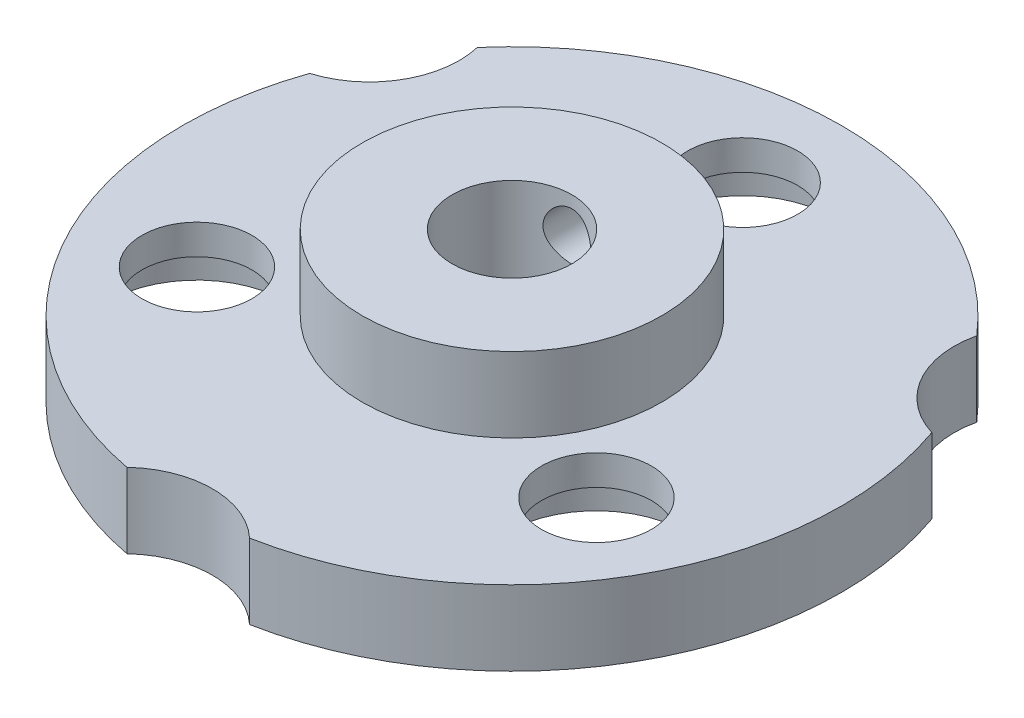
ISO-10303-21;
HEADER;
FILE_DESCRIPTION(('STEP AP214'),'2;1');
FILE_NAME('part.step','',(''),(''),'','','');
FILE_SCHEMA(('AUTOMOTIVE_DESIGN { 1 0 10303 214 1 1 1 1 }'));
ENDSEC;
DATA;
#1=APPLICATION_CONTEXT('core data for automotive mechanical design processes');
#2=APPLICATION_PROTOCOL_DEFINITION('international standard','automotive_design',2000,#1);
#3=PRODUCT_CONTEXT('',#1,'mechanical');
#4=PRODUCT('Part','Part','',(#3));
#5=PRODUCT_RELATED_PRODUCT_CATEGORY('part','',(#4));
#6=PRODUCT_DEFINITION_FORMATION('','',#4);
#7=PRODUCT_DEFINITION_CONTEXT('part definition',#1,'design');
#8=PRODUCT_DEFINITION('design','',#6,#7);
#9=PRODUCT_DEFINITION_SHAPE('','',#8);
#10=(LENGTH_UNIT() NAMED_UNIT(*) SI_UNIT(.MILLI.,.METRE.));
#11=(NAMED_UNIT(*) PLANE_ANGLE_UNIT() SI_UNIT($,.RADIAN.));
#12=(NAMED_UNIT(*) SI_UNIT($,.STERADIAN.) SOLID_ANGLE_UNIT());
#13=UNCERTAINTY_MEASURE_WITH_UNIT(LENGTH_MEASURE(1.E-05),#10,'distance_accuracy_value','');
#14=(GEOMETRIC_REPRESENTATION_CONTEXT(3) GLOBAL_UNCERTAINTY_ASSIGNED_CONTEXT((#13)) GLOBAL_UNIT_ASSIGNED_CONTEXT((#10,
#11,#12)) REPRESENTATION_CONTEXT('',''));
#15=CARTESIAN_POINT('',(0.,0.,0.));
#16=DIRECTION('',(0.,0.,1.));
#17=DIRECTION('',(1.,0.,0.));
#18=AXIS2_PLACEMENT_3D('',#15,#16,#17);
#19=CARTESIAN_POINT('',(0.,0.,-7.7));
#20=DIRECTION('',(0.,1.,0.));
#21=DIRECTION('',(0.,0.,1.));
#22=AXIS2_PLACEMENT_3D('',#19,#20,#21);
#23=CYLINDRICAL_SURFACE('',#22,1.83552150537951);
#24=CARTESIAN_POINT('',(0.,2.5,-7.7));
#25=DIRECTION('',(0.,1.,0.));
#26=DIRECTION('',(0.,0.,1.));
#27=AXIS2_PLACEMENT_3D('',#24,#25,#26);
#28=CIRCLE('',#27,1.83552150537951);
#29=CARTESIAN_POINT('',(0.,2.5,-5.86447849462049));
#30=VERTEX_POINT('',#29);
#31=EDGE_CURVE('E259',#30,#30,#28,.T.);
#32=ORIENTED_EDGE('',*,*,#31,.T.);
#33=EDGE_LOOP('',(#32));
#34=FACE_BOUND('',#33,.T.);
#35=CARTESIAN_POINT('',(0.,1.5,-7.7));
#36=DIRECTION('',(0.,-1.,0.));
#37=DIRECTION('',(0.,0.,-1.));
#38=AXIS2_PLACEMENT_3D('',#35,#36,#37);
#39=CIRCLE('',#38,1.83552150537951);
#40=CARTESIAN_POINT('',(0.,1.5,-9.5355215053795));
#41=VERTEX_POINT('',#40);
#42=EDGE_CURVE('E37',#41,#41,#39,.F.);
#43=ORIENTED_EDGE('',*,*,#42,.F.);
#44=EDGE_LOOP('',(#43));
#45=FACE_BOUND('',#44,.T.);
#46=ADVANCED_FACE('F33',(#34,#45),#23,.F.);
#47=CARTESIAN_POINT('',(-6.66839560914018,0.,3.85));
#48=DIRECTION('',(0.,1.,0.));
#49=DIRECTION('',(0.,0.,1.));
#50=AXIS2_PLACEMENT_3D('',#47,#48,#49);
#51=CYLINDRICAL_SURFACE('',#50,1.83552150537951);
#52=CARTESIAN_POINT('',(-6.66839560914018,2.5,3.85));
#53=DIRECTION('',(0.,1.,0.));
#54=DIRECTION('',(0.,0.,1.));
#55=AXIS2_PLACEMENT_3D('',#52,#53,#54);
#56=CIRCLE('',#55,1.83552150537951);
#57=CARTESIAN_POINT('',(-6.66839560914018,2.5,5.68552150537951));
#58=VERTEX_POINT('',#57);
#59=EDGE_CURVE('E263',#58,#58,#56,.T.);
#60=ORIENTED_EDGE('',*,*,#59,.T.);
#61=EDGE_LOOP('',(#60));
#62=FACE_BOUND('',#61,.T.);
#63=CARTESIAN_POINT('',(-6.66839560914018,1.5,3.85));
#64=DIRECTION('',(0.,-1.,0.));
#65=DIRECTION('',(0.,0.,-1.));
#66=AXIS2_PLACEMENT_3D('',#63,#64,#65);
#67=CIRCLE('',#66,1.83552150537951);
#68=CARTESIAN_POINT('',(-6.66839560914018,1.5,2.0144784946205));
#69=VERTEX_POINT('',#68);
#70=EDGE_CURVE('E127',#69,#69,#67,.F.);
#71=ORIENTED_EDGE('',*,*,#70,.F.);
#72=EDGE_LOOP('',(#71));
#73=FACE_BOUND('',#72,.T.);
#74=ADVANCED_FACE('F218',(#62,#73),#51,.F.);
#75=CARTESIAN_POINT('',(6.66839560914018,0.,3.85));
#76=DIRECTION('',(0.,1.,0.));
#77=DIRECTION('',(0.,0.,1.));
#78=AXIS2_PLACEMENT_3D('',#75,#76,#77);
#79=CYLINDRICAL_SURFACE('',#78,1.83552150537951);
#80=CARTESIAN_POINT('',(6.66839560914018,2.5,3.85));
#81=DIRECTION('',(0.,1.,0.));
#82=DIRECTION('',(0.,0.,1.));
#83=AXIS2_PLACEMENT_3D('',#80,#81,#82);
#84=CIRCLE('',#83,1.83552150537951);
#85=CARTESIAN_POINT('',(6.66839560914018,2.5,5.6855215053795));
#86=VERTEX_POINT('',#85);
#87=EDGE_CURVE('E260',#86,#86,#84,.T.);
#88=ORIENTED_EDGE('',*,*,#87,.T.);
#89=EDGE_LOOP('',(#88));
#90=FACE_BOUND('',#89,.T.);
#91=CARTESIAN_POINT('',(6.66839560914018,1.5,3.85));
#92=DIRECTION('',(0.,-1.,0.));
#93=DIRECTION('',(0.,0.,-1.));
#94=AXIS2_PLACEMENT_3D('',#91,#92,#93);
#95=CIRCLE('',#94,1.83552150537951);
#96=CARTESIAN_POINT('',(6.66839560914018,1.5,2.01447849462049));
#97=VERTEX_POINT('',#96);
#98=EDGE_CURVE('E103',#97,#97,#95,.F.);
#99=ORIENTED_EDGE('',*,*,#98,.F.);
#100=EDGE_LOOP('',(#99));
#101=FACE_BOUND('',#100,.T.);
#102=ADVANCED_FACE('F225',(#90,#101),#79,.F.);
#103=CARTESIAN_POINT('',(0.,2.5,0.));
#104=DIRECTION('',(0.,-1.,0.));
#105=DIRECTION('',(0.,0.,-1.));
#106=AXIS2_PLACEMENT_3D('',#103,#104,#105);
#107=CYLINDRICAL_SURFACE('',#106,11.);
#108=CARTESIAN_POINT('',(0.,0.,0.));
#109=DIRECTION('',(0.,1.,0.));
#110=DIRECTION('',(0.,0.,1.));
#111=AXIS2_PLACEMENT_3D('',#108,#109,#110);
#112=CIRCLE('',#111,11.);
#113=CARTESIAN_POINT('',(2.04787377107266,0.,10.8076923076924));
#114=VERTEX_POINT('',#113);
#115=CARTESIAN_POINT('',(10.3836729802836,0.,-3.63033544435343));
#116=VERTEX_POINT('',#115);
#117=EDGE_CURVE('E112',#114,#116,#112,.T.);
#118=ORIENTED_EDGE('',*,*,#117,.T.);
#119=DIRECTION('',(0.,1.,0.));
#120=VECTOR('',#119,1.);
#121=CARTESIAN_POINT('',(10.3836729802836,-0.25,-3.63033544435342));
#122=LINE('',#121,#120);
#123=CARTESIAN_POINT('',(10.3836729802836,2.5,-3.63033544435342));
#124=VERTEX_POINT('',#123);
#125=EDGE_CURVE('E50',#116,#124,#122,.T.);
#126=ORIENTED_EDGE('',*,*,#125,.T.);
#127=CARTESIAN_POINT('',(0.,2.5,0.));
#128=DIRECTION('',(0.,1.,0.));
#129=DIRECTION('',(0.,0.,1.));
#130=AXIS2_PLACEMENT_3D('',#127,#128,#129);
#131=CIRCLE('',#130,11.);
#132=CARTESIAN_POINT('',(2.04787377107267,2.5,10.8076923076924));
#133=VERTEX_POINT('',#132);
#134=EDGE_CURVE('E102',#133,#124,#131,.T.);
#135=ORIENTED_EDGE('',*,*,#134,.F.);
#136=DIRECTION('',(0.,1.,0.));
#137=VECTOR('',#136,1.);
#138=CARTESIAN_POINT('',(2.04787377107266,-0.25,10.8076923076924));
#139=LINE('',#138,#137);
#140=EDGE_CURVE('E151',#133,#114,#139,.F.);
#141=ORIENTED_EDGE('',*,*,#140,.T.);
#142=EDGE_LOOP('',(#118,#126,#135,#141));
#143=FACE_BOUND('',#142,.T.);
#144=ADVANCED_FACE('F246',(#143),#107,.T.);
#145=CARTESIAN_POINT('',(-10.3836729802836,0.,-3.6303354443534));
#146=VERTEX_POINT('',#145);
#147=CARTESIAN_POINT('',(-2.04787377107266,0.,10.8076923076924));
#148=VERTEX_POINT('',#147);
#149=EDGE_CURVE('E108',#146,#148,#112,.T.);
#150=ORIENTED_EDGE('',*,*,#149,.T.);
#151=DIRECTION('',(0.,1.,0.));
#152=VECTOR('',#151,1.);
#153=CARTESIAN_POINT('',(-2.04787377107266,-0.25,10.8076923076924));
#154=LINE('',#153,#152);
#155=CARTESIAN_POINT('',(-2.04787377107267,2.5,10.8076923076924));
#156=VERTEX_POINT('',#155);
#157=EDGE_CURVE('E57',#148,#156,#154,.T.);
#158=ORIENTED_EDGE('',*,*,#157,.T.);
#159=CARTESIAN_POINT('',(-10.3836729802836,2.5,-3.63033544435341));
#160=VERTEX_POINT('',#159);
#161=EDGE_CURVE('E110',#160,#156,#131,.T.);
#162=ORIENTED_EDGE('',*,*,#161,.F.);
#163=DIRECTION('',(0.,1.,0.));
#164=VECTOR('',#163,1.);
#165=CARTESIAN_POINT('',(-10.3836729802836,-0.25,-3.63033544435341));
#166=LINE('',#165,#164);
#167=EDGE_CURVE('E157',#160,#146,#166,.F.);
#168=ORIENTED_EDGE('',*,*,#167,.T.);
#169=EDGE_LOOP('',(#150,#158,#162,#168));
#170=FACE_BOUND('',#169,.T.);
#171=ADVANCED_FACE('F233',(#170),#107,.T.);
#172=CARTESIAN_POINT('',(0.,2.5,0.));
#173=DIRECTION('',(0.,1.,0.));
#174=DIRECTION('',(0.,0.,1.));
#175=AXIS2_PLACEMENT_3D('',#172,#173,#174);
#176=PLANE('',#175);
#177=CARTESIAN_POINT('',(11.258330249198,2.5,-6.50000000000016));
#178=DIRECTION('',(0.,1.,0.));
#179=DIRECTION('',(0.,0.,1.));
#180=AXIS2_PLACEMENT_3D('',#177,#178,#179);
#181=CIRCLE('',#180,3.);
#182=CARTESIAN_POINT('',(8.33579920921091,2.5,-7.17735686333895));
#183=VERTEX_POINT('',#182);
#184=EDGE_CURVE('E88',#183,#124,#181,.T.);
#185=ORIENTED_EDGE('',*,*,#184,.F.);
#186=CARTESIAN_POINT('',(-8.33579920921092,2.5,-7.17735686333894));
#187=VERTEX_POINT('',#186);
#188=EDGE_CURVE('E98',#183,#187,#131,.T.);
#189=ORIENTED_EDGE('',*,*,#188,.T.);
#190=CARTESIAN_POINT('',(-11.258330249198,2.5,-6.50000000000015));
#191=DIRECTION('',(0.,1.,0.));
#192=DIRECTION('',(0.,0.,1.));
#193=AXIS2_PLACEMENT_3D('',#190,#191,#192);
#194=CIRCLE('',#193,3.);
#195=EDGE_CURVE('E155',#160,#187,#194,.T.);
#196=ORIENTED_EDGE('',*,*,#195,.F.);
#197=ORIENTED_EDGE('',*,*,#161,.T.);
#198=CARTESIAN_POINT('',(0.,2.5,13.0000000000003));
#199=DIRECTION('',(0.,1.,0.));
#200=DIRECTION('',(0.,0.,1.));
#201=AXIS2_PLACEMENT_3D('',#198,#199,#200);
#202=CIRCLE('',#201,3.);
#203=EDGE_CURVE('E149',#133,#156,#202,.T.);
#204=ORIENTED_EDGE('',*,*,#203,.F.);
#205=ORIENTED_EDGE('',*,*,#134,.T.);
#206=EDGE_LOOP('',(#185,#189,#196,#197,#204,#205));
#207=FACE_BOUND('',#206,.T.);
#208=ORIENTED_EDGE('',*,*,#31,.F.);
#209=EDGE_LOOP('',(#208));
#210=FACE_BOUND('',#209,.T.);
#211=ORIENTED_EDGE('',*,*,#87,.F.);
#212=EDGE_LOOP('',(#211));
#213=FACE_BOUND('',#212,.T.);
#214=ORIENTED_EDGE('',*,*,#59,.F.);
#215=EDGE_LOOP('',(#214));
#216=FACE_BOUND('',#215,.T.);
#217=CARTESIAN_POINT('',(0.,2.5,0.));
#218=DIRECTION('',(0.,1.,0.));
#219=DIRECTION('',(0.,0.,1.));
#220=AXIS2_PLACEMENT_3D('',#217,#218,#219);
#221=CIRCLE('',#220,5.);
#222=CARTESIAN_POINT('',(0.,2.5,5.));
#223=VERTEX_POINT('',#222);
#224=EDGE_CURVE('E269',#223,#223,#221,.T.);
#225=ORIENTED_EDGE('',*,*,#224,.F.);
#226=EDGE_LOOP('',(#225));
#227=FACE_BOUND('',#226,.T.);
#228=ADVANCED_FACE('F95',(#207,#210,#213,#216,#227),#176,.T.);
#229=ORIENTED_EDGE('',*,*,#188,.F.);
#230=DIRECTION('',(0.,1.,0.));
#231=VECTOR('',#230,1.);
#232=CARTESIAN_POINT('',(8.33579920921091,-0.25,-7.17735686333894));
#233=LINE('',#232,#231);
#234=CARTESIAN_POINT('',(8.33579920921092,0.,-7.17735686333894));
#235=VERTEX_POINT('',#234);
#236=EDGE_CURVE('E85',#183,#235,#233,.F.);
#237=ORIENTED_EDGE('',*,*,#236,.T.);
#238=CARTESIAN_POINT('',(-8.33579920921091,0.,-7.17735686333895));
#239=VERTEX_POINT('',#238);
#240=EDGE_CURVE('E114',#235,#239,#112,.T.);
#241=ORIENTED_EDGE('',*,*,#240,.T.);
#242=DIRECTION('',(0.,1.,0.));
#243=VECTOR('',#242,1.);
#244=CARTESIAN_POINT('',(-8.33579920921092,-0.25,-7.17735686333895));
#245=LINE('',#244,#243);
#246=EDGE_CURVE('E107',#239,#187,#245,.T.);
#247=ORIENTED_EDGE('',*,*,#246,.T.);
#248=EDGE_LOOP('',(#229,#237,#241,#247));
#249=FACE_BOUND('',#248,.T.);
#250=ADVANCED_FACE('F35',(#249),#107,.T.);
#251=CARTESIAN_POINT('',(0.,0.,0.));
#252=DIRECTION('',(0.,1.,0.));
#253=DIRECTION('',(0.,0.,1.));
#254=AXIS2_PLACEMENT_3D('',#251,#252,#253);
#255=PLANE('',#254);
#256=CARTESIAN_POINT('',(0.,0.,-7.7));
#257=DIRECTION('',(0.,-1.,0.));
#258=DIRECTION('',(0.,0.,-1.));
#259=AXIS2_PLACEMENT_3D('',#256,#257,#258);
#260=CIRCLE('',#259,3.);
#261=CARTESIAN_POINT('',(0.,0.,-10.7));
#262=VERTEX_POINT('',#261);
#263=EDGE_CURVE('E143',#262,#262,#260,.T.);
#264=ORIENTED_EDGE('',*,*,#263,.F.);
#265=EDGE_LOOP('',(#264));
#266=FACE_BOUND('',#265,.T.);
#267=CARTESIAN_POINT('',(-6.66839560914018,0.,3.85));
#268=DIRECTION('',(0.,-1.,0.));
#269=DIRECTION('',(0.,0.,-1.));
#270=AXIS2_PLACEMENT_3D('',#267,#268,#269);
#271=CIRCLE('',#270,3.);
#272=CARTESIAN_POINT('',(-6.66839560914018,0.,0.850000000000001));
#273=VERTEX_POINT('',#272);
#274=EDGE_CURVE('E136',#273,#273,#271,.T.);
#275=ORIENTED_EDGE('',*,*,#274,.F.);
#276=EDGE_LOOP('',(#275));
#277=FACE_BOUND('',#276,.T.);
#278=CARTESIAN_POINT('',(6.66839560914018,0.,3.85));
#279=DIRECTION('',(0.,-1.,0.));
#280=DIRECTION('',(0.,0.,-1.));
#281=AXIS2_PLACEMENT_3D('',#278,#279,#280);
#282=CIRCLE('',#281,3.);
#283=CARTESIAN_POINT('',(6.66839560914018,0.,0.849999999999996));
#284=VERTEX_POINT('',#283);
#285=EDGE_CURVE('E129',#284,#284,#282,.T.);
#286=ORIENTED_EDGE('',*,*,#285,.F.);
#287=EDGE_LOOP('',(#286));
#288=FACE_BOUND('',#287,.T.);
#289=CARTESIAN_POINT('',(0.,0.,0.));
#290=DIRECTION('',(0.,1.,0.));
#291=DIRECTION('',(0.,0.,1.));
#292=AXIS2_PLACEMENT_3D('',#289,#290,#291);
#293=CIRCLE('',#292,2.);
#294=CARTESIAN_POINT('',(0.,0.,2.));
#295=VERTEX_POINT('',#294);
#296=EDGE_CURVE('E256',#295,#295,#293,.T.);
#297=ORIENTED_EDGE('',*,*,#296,.T.);
#298=EDGE_LOOP('',(#297));
#299=FACE_BOUND('',#298,.T.);
#300=ORIENTED_EDGE('',*,*,#240,.F.);
#301=CARTESIAN_POINT('',(11.258330249198,0.,-6.50000000000016));
#302=DIRECTION('',(0.,1.,0.));
#303=DIRECTION('',(0.,0.,1.));
#304=AXIS2_PLACEMENT_3D('',#301,#302,#303);
#305=CIRCLE('',#304,3.);
#306=EDGE_CURVE('E11',#235,#116,#305,.T.);
#307=ORIENTED_EDGE('',*,*,#306,.T.);
#308=ORIENTED_EDGE('',*,*,#117,.F.);
#309=CARTESIAN_POINT('',(0.,0.,13.0000000000003));
#310=DIRECTION('',(0.,1.,0.));
#311=DIRECTION('',(0.,0.,1.));
#312=AXIS2_PLACEMENT_3D('',#309,#310,#311);
#313=CIRCLE('',#312,3.);
#314=EDGE_CURVE('E42',#114,#148,#313,.T.);
#315=ORIENTED_EDGE('',*,*,#314,.T.);
#316=ORIENTED_EDGE('',*,*,#149,.F.);
#317=CARTESIAN_POINT('',(-11.258330249198,0.,-6.50000000000015));
#318=DIRECTION('',(0.,1.,0.));
#319=DIRECTION('',(0.,0.,1.));
#320=AXIS2_PLACEMENT_3D('',#317,#318,#319);
#321=CIRCLE('',#320,3.);
#322=EDGE_CURVE('E117',#146,#239,#321,.T.);
#323=ORIENTED_EDGE('',*,*,#322,.T.);
#324=EDGE_LOOP('',(#300,#307,#308,#315,#316,#323));
#325=FACE_BOUND('',#324,.T.);
#326=ADVANCED_FACE('F234',(#266,#277,#288,#299,#325),#255,.F.);
#327=CARTESIAN_POINT('',(0.,5.,0.));
#328=DIRECTION('',(0.,-1.,0.));
#329=DIRECTION('',(0.,0.,-1.));
#330=AXIS2_PLACEMENT_3D('',#327,#328,#329);
#331=CYLINDRICAL_SURFACE('',#330,5.);
#332=CARTESIAN_POINT('',(0.,4.59295521709407,-5.));
#333=CARTESIAN_POINT('',(-0.0446345464348313,4.59280840972482,-4.99999925421206));
#334=CARTESIAN_POINT('',(-0.0892819443510236,4.58891705369241,-4.9993960875234));
#335=CARTESIAN_POINT('',(-0.177301891678727,4.57375034444031,-4.99704993433986));
#336=CARTESIAN_POINT('',(-0.220673197606511,4.56246802289333,-4.99530587219164));
#337=CARTESIAN_POINT('',(-0.304854977903621,4.53286726162525,-4.99087558705497));
#338=CARTESIAN_POINT('',(-0.345667459361669,4.51455441889718,-4.98819011367073));
#339=CARTESIAN_POINT('',(-0.423635297501165,4.47142634078325,-4.98217463731942));
#340=CARTESIAN_POINT('',(-0.460791109846799,4.44661191698615,-4.97884471481213));
#341=CARTESIAN_POINT('',(-0.530725668288752,4.39095066663555,-4.97187860497349));
#342=CARTESIAN_POINT('',(-0.563467348194362,4.36005754142335,-4.96824019736804));
#343=CARTESIAN_POINT('',(-0.623325168104827,4.29321676146511,-4.96108624127247));
#344=CARTESIAN_POINT('',(-0.650440971001116,4.25726880404452,-4.95757070015512));
#345=CARTESIAN_POINT('',(-0.698418461816588,4.18109293926852,-4.95104061891818));
#346=CARTESIAN_POINT('',(-0.719244831066632,4.1408425198778,-4.94802894895029));
#347=CARTESIAN_POINT('',(-0.753826505269504,4.0573583918758,-4.9428790397377));
#348=CARTESIAN_POINT('',(-0.767582254949818,4.01412487108954,-4.94074074556118));
#349=CARTESIAN_POINT('',(-0.787517076477999,3.92629609351829,-4.93760253956309));
#350=CARTESIAN_POINT('',(-0.793760297058806,3.88171574712982,-4.93659299479914));
#351=CARTESIAN_POINT('',(-0.798690889447801,3.79212975820018,-4.93579776042976));
#352=CARTESIAN_POINT('',(-0.797378748811143,3.74712414328914,-4.9360119918528));
#353=CARTESIAN_POINT('',(-0.787288858704422,3.65841063797979,-4.93763113481972));
#354=CARTESIAN_POINT('',(-0.778581283745989,3.61469453280229,-4.93902485388638));
#355=CARTESIAN_POINT('',(-0.754056623447387,3.52935153996084,-4.94282826426096));
#356=CARTESIAN_POINT('',(-0.738239305621578,3.48772472066515,-4.94523798879167));
#357=CARTESIAN_POINT('',(-0.699868024192291,3.40752234623805,-4.95081411790351));
#358=CARTESIAN_POINT('',(-0.677283485215563,3.36896166684933,-4.95398394347471));
#359=CARTESIAN_POINT('',(-0.626041212269111,3.29614996590887,-4.9607195182505));
#360=CARTESIAN_POINT('',(-0.597383026549829,3.26189926522965,-4.96428529689616));
#361=CARTESIAN_POINT('',(-0.534418967683772,3.19827161328361,-4.97145948250141));
#362=CARTESIAN_POINT('',(-0.500052548802766,3.16895454552508,-4.97506791289197));
#363=CARTESIAN_POINT('',(-0.426855352339007,3.11649466439161,-4.98188150665978));
#364=CARTESIAN_POINT('',(-0.388024554815837,3.09335187859599,-4.98508666823568));
#365=CARTESIAN_POINT('',(-0.306953152851498,3.05389666610304,-4.99073439993172));
#366=CARTESIAN_POINT('',(-0.264710579067382,3.03758821841366,-4.99317652559617));
#367=CARTESIAN_POINT('',(-0.178038476907493,3.01231358506911,-4.99701733008075));
#368=CARTESIAN_POINT('',(-0.133609117789079,3.00334683211061,-4.99841608952256));
#369=CARTESIAN_POINT('',(-0.0443428342577001,2.99308885599946,-5.00000045238604));
#370=CARTESIAN_POINT('',(0.000484388161034169,2.99171513888676,-5.00019909658237));
#371=CARTESIAN_POINT('',(0.0897277032897241,2.99646392886732,-4.99939398406668));
#372=CARTESIAN_POINT('',(0.134143810122924,3.00258617747796,-4.99839026881552));
#373=CARTESIAN_POINT('',(0.221058825336589,3.02208504347062,-4.99529929653219));
#374=CARTESIAN_POINT('',(0.263566806501661,3.03542223188221,-4.99321793138338));
#375=CARTESIAN_POINT('',(0.345743289629186,3.06893109522977,-4.98820186778873));
#376=CARTESIAN_POINT('',(0.385411640694736,3.08910313304105,-4.98526712403657));
#377=CARTESIAN_POINT('',(0.461145134721012,3.13590295965188,-4.97883553280157));
#378=CARTESIAN_POINT('',(0.49717764390488,3.16258293348531,-4.97533422270727));
#379=CARTESIAN_POINT('',(0.564283089849037,3.22156791963512,-4.9681712513089));
#380=CARTESIAN_POINT('',(0.595355698403196,3.25387330390017,-4.9645095794138));
#381=CARTESIAN_POINT('',(0.651957795364863,3.3235577117943,-4.9573959412819));
#382=CARTESIAN_POINT('',(0.677432262603723,3.36098169719568,-4.95394627756548));
#383=CARTESIAN_POINT('',(0.721732833216668,3.43962673186726,-4.9476867714127));
#384=CARTESIAN_POINT('',(0.740559142226738,3.48084766364334,-4.94487690918741));
#385=CARTESIAN_POINT('',(0.770943170127823,3.56575058190925,-4.94023112007101));
#386=CARTESIAN_POINT('',(0.782530149288911,3.60942187342313,-4.93839127728325));
#387=CARTESIAN_POINT('',(0.79819980367199,3.69812236414841,-4.93588301608632));
#388=CARTESIAN_POINT('',(0.802283073557574,3.74315145546765,-4.93521450485016));
#389=CARTESIAN_POINT('',(0.802815962429541,3.83273817599765,-4.93512779371066));
#390=CARTESIAN_POINT('',(0.799352463469276,3.87729529912648,-4.93569536340789));
#391=CARTESIAN_POINT('',(0.78507589069214,3.96518430315666,-4.93798615841887));
#392=CARTESIAN_POINT('',(0.774262828172742,4.00851618594129,-4.93970938195619));
#393=CARTESIAN_POINT('',(0.745624187596046,4.09270216575181,-4.94411292837317));
#394=CARTESIAN_POINT('',(0.727804436540425,4.1335582892027,-4.94679245578731));
#395=CARTESIAN_POINT('',(0.685666554935631,4.21171525048427,-4.9528085340871));
#396=CARTESIAN_POINT('',(0.661348141854866,4.24901593364528,-4.95614511353666));
#397=CARTESIAN_POINT('',(0.606587081465107,4.3194447098727,-4.96314620762862));
#398=CARTESIAN_POINT('',(0.57608008604431,4.3525224588935,-4.9668139223735));
#399=CARTESIAN_POINT('',(0.509945409149719,4.41311877418437,-4.97403858748415));
#400=CARTESIAN_POINT('',(0.474316548786263,4.44063605709539,-4.97759551211962));
#401=CARTESIAN_POINT('',(0.398688189514482,4.48948390134341,-4.98422474154444));
#402=CARTESIAN_POINT('',(0.358663017320111,4.51077513877548,-4.98729391237595));
#403=CARTESIAN_POINT('',(0.275572401990428,4.54629917536374,-4.99257309312883));
#404=CARTESIAN_POINT('',(0.232510090751464,4.56053912765659,-4.9947839732444));
#405=CARTESIAN_POINT('',(0.157722389070857,4.57841711433274,-4.99760747858701));
#406=CARTESIAN_POINT('',(0.126447109545309,4.58395060419822,-4.99850013479712));
#407=CARTESIAN_POINT('',(0.0634500468027397,4.59127180597416,-4.99969665612681));
#408=CARTESIAN_POINT('',(0.0317282703374389,4.59305957446456,-5.00000053014007));
#409=CARTESIAN_POINT('',(0.,4.59295521709407,-5.));
#410=B_SPLINE_CURVE_WITH_KNOTS('',3,(#332,#333,#334,#335,#336,#337,#338,#339,#340,#341,#342,
#343,#344,#345,#346,#347,#348,#349,#350,#351,#352,#353,#354,#355,#356,#357,#358,#359,#360,#361,
#362,#363,#364,#365,#366,#367,#368,#369,#370,#371,#372,#373,#374,#375,#376,#377,#378,#379,#380,
#381,#382,#383,#384,#385,#386,#387,#388,#389,#390,#391,#392,#393,#394,#395,#396,#397,#398,#399,
#400,#401,#402,#403,#404,#405,#406,#407,#408,#409),.UNSPECIFIED.,.T.,.F.,(4,2,2,2,2,2,2,2,2,2,2,
2,2,2,2,2,2,2,2,2,2,2,2,2,2,2,2,2,2,2,2,2,2,2,2,2,2,2,4),(0.,0.133788385130539,
0.267703090104946,0.401511406008692,0.535303026646016,0.670156140567426,0.805017332699408,
0.940622335585652,1.07621880815101,1.21064902767122,1.34507057236968,1.47823067492862,
1.61139513208442,1.7451705597479,1.87895594093932,2.01426343587848,2.14957153520019,
2.28495830293327,2.42033460814823,2.55423719337488,2.68813516138254,2.82130867464517,
2.95448925945418,3.08877506801445,3.22306975884365,3.3586305509906,3.49418714970257,
3.62919224330303,3.7641866373849,3.8976351294267,4.03108341633699,4.16442095702508,
4.29776429555247,4.43257259927336,4.56741198138658,4.70308547687105,4.83862105572563,
4.933725375399,5.02882825849044),.UNSPECIFIED.);
#411=CARTESIAN_POINT('',(0.,4.59295521709407,-5.));
#412=VERTEX_POINT('',#411);
#413=EDGE_CURVE('E168',#412,#412,#410,.T.);
#414=ORIENTED_EDGE('',*,*,#413,.T.);
#415=EDGE_LOOP('',(#414));
#416=FACE_BOUND('',#415,.T.);
#417=CARTESIAN_POINT('',(0.,5.,0.));
#418=DIRECTION('',(0.,1.,0.));
#419=DIRECTION('',(0.,0.,1.));
#420=AXIS2_PLACEMENT_3D('',#417,#418,#419);
#421=CIRCLE('',#420,5.);
#422=CARTESIAN_POINT('',(0.,5.,5.));
#423=VERTEX_POINT('',#422);
#424=EDGE_CURVE('E268',#423,#423,#421,.T.);
#425=ORIENTED_EDGE('',*,*,#424,.F.);
#426=EDGE_LOOP('',(#425));
#427=FACE_BOUND('',#426,.T.);
#428=ORIENTED_EDGE('',*,*,#224,.T.);
#429=EDGE_LOOP('',(#428));
#430=FACE_BOUND('',#429,.T.);
#431=ADVANCED_FACE('F236',(#416,#427,#430),#331,.T.);
#432=CARTESIAN_POINT('',(0.,5.,0.));
#433=DIRECTION('',(0.,1.,0.));
#434=DIRECTION('',(0.,0.,1.));
#435=AXIS2_PLACEMENT_3D('',#432,#433,#434);
#436=PLANE('',#435);
#437=CARTESIAN_POINT('',(0.,5.,0.));
#438=DIRECTION('',(0.,1.,0.));
#439=DIRECTION('',(0.,0.,1.));
#440=AXIS2_PLACEMENT_3D('',#437,#438,#439);
#441=CIRCLE('',#440,2.);
#442=CARTESIAN_POINT('',(0.,5.,2.));
#443=VERTEX_POINT('',#442);
#444=EDGE_CURVE('E274',#443,#443,#441,.T.);
#445=ORIENTED_EDGE('',*,*,#444,.F.);
#446=EDGE_LOOP('',(#445));
#447=FACE_BOUND('',#446,.T.);
#448=ORIENTED_EDGE('',*,*,#424,.T.);
#449=EDGE_LOOP('',(#448));
#450=FACE_BOUND('',#449,.T.);
#451=ADVANCED_FACE('F243',(#447,#450),#436,.T.);
#452=CARTESIAN_POINT('',(0.,-0.5,0.));
#453=DIRECTION('',(0.,1.,0.));
#454=DIRECTION('',(0.,0.,1.));
#455=AXIS2_PLACEMENT_3D('',#452,#453,#454);
#456=CYLINDRICAL_SURFACE('',#455,2.);
#457=CARTESIAN_POINT('',(-0.799047163232813,3.79295943814312,-1.83344583528655));
#458=CARTESIAN_POINT('',(-0.799042462665124,3.83581523738308,-1.83345016148734));
#459=CARTESIAN_POINT('',(-0.795582298961543,3.878731652025,-1.83496816656248));
#460=CARTESIAN_POINT('',(-0.781870924640436,3.96333337129395,-1.84085028760058));
#461=CARTESIAN_POINT('',(-0.77160236073739,4.00501524497531,-1.84522167583811));
#462=CARTESIAN_POINT('',(-0.74472932715532,4.08578061493114,-1.85622915151899));
#463=CARTESIAN_POINT('',(-0.728148728191176,4.12487325708722,-1.86285669680965));
#464=CARTESIAN_POINT('',(-0.689192297844292,4.19971345848696,-1.87761712591289));
#465=CARTESIAN_POINT('',(-0.666817731835187,4.23546174580346,-1.88574968092829));
#466=CARTESIAN_POINT('',(-0.615539712811226,4.3046635990397,-1.90312364779918));
#467=CARTESIAN_POINT('',(-0.586357840324346,4.3379020073149,-1.91240069322624));
#468=CARTESIAN_POINT('',(-0.522880208430889,4.39917103706927,-1.93072185889342));
#469=CARTESIAN_POINT('',(-0.488582669464801,4.42719983865906,-1.93976589678943));
#470=CARTESIAN_POINT('',(-0.414185402195356,4.4783219969362,-1.95702917136805));
#471=CARTESIAN_POINT('',(-0.373910211072263,4.50117715873137,-1.96520182230166));
#472=CARTESIAN_POINT('',(-0.289701380398091,4.53969686549904,-1.97936655195159));
#473=CARTESIAN_POINT('',(-0.245769238148498,4.55536433645589,-1.9853595177737));
#474=CARTESIAN_POINT('',(-0.15775007590205,4.57829603271807,-1.99423556096864));
#475=CARTESIAN_POINT('',(-0.113773523697688,4.58593036377872,-1.99725515136257));
#476=CARTESIAN_POINT('',(-0.0250668487170979,4.59377083240819,-2.00033454157052));
#477=CARTESIAN_POINT('',(0.0196629867650228,4.59397974051705,-2.00039544531936));
#478=CARTESIAN_POINT('',(0.105931294208234,4.58716633023312,-1.99763306267521));
#479=CARTESIAN_POINT('',(0.147507899770071,4.58054952904434,-1.99497158842065));
#480=CARTESIAN_POINT('',(0.228902174751904,4.56096228761881,-1.98727846099662));
#481=CARTESIAN_POINT('',(0.268719714875986,4.54799138118296,-1.98224663391601));
#482=CARTESIAN_POINT('',(0.346183249643453,4.51590484499259,-1.97020763308979));
#483=CARTESIAN_POINT('',(0.383787471768837,4.4966995522169,-1.96317183115119));
#484=CARTESIAN_POINT('',(0.455335714177721,4.45277343537551,-1.94782194029242));
#485=CARTESIAN_POINT('',(0.489278474026519,4.42805072090407,-1.93950741355362));
#486=CARTESIAN_POINT('',(0.554906472629291,4.37189978376448,-1.92179839226061));
#487=CARTESIAN_POINT('',(0.586297182710696,4.34013788110958,-1.91236883284082));
#488=CARTESIAN_POINT('',(0.643427425666812,4.27176320941473,-1.89391247433249));
#489=CARTESIAN_POINT('',(0.669165108827847,4.23514885888145,-1.88488580784112));
#490=CARTESIAN_POINT('',(0.714932684947921,4.15679182917954,-1.86801625144648));
#491=CARTESIAN_POINT('',(0.734780817558311,4.11493350594959,-1.86021400116245));
#492=CARTESIAN_POINT('',(0.767030676121984,4.02807324195831,-1.84715194248047));
#493=CARTESIAN_POINT('',(0.779437238497364,3.98307336423478,-1.8418904832071));
#494=CARTESIAN_POINT('',(0.795735790485007,3.8941451271687,-1.83490569798837));
#495=CARTESIAN_POINT('',(0.800101652415489,3.85031925929505,-1.83298585564763));
#496=CARTESIAN_POINT('',(0.801577009622707,3.76252855503594,-1.83234161445076));
#497=CARTESIAN_POINT('',(0.798688705387972,3.71856376483198,-1.83361624657819));
#498=CARTESIAN_POINT('',(0.786169103831115,3.63437586416117,-1.83901580962576));
#499=CARTESIAN_POINT('',(0.776931226908903,3.59408226318332,-1.84297426536608));
#500=CARTESIAN_POINT('',(0.752484930936952,3.51564407622872,-1.85308934576475));
#501=CARTESIAN_POINT('',(0.737275188035641,3.4774999689002,-1.85924645779688));
#502=CARTESIAN_POINT('',(0.700628046591321,3.40271849502493,-1.8733712247657));
#503=CARTESIAN_POINT('',(0.678963109315047,3.36620496266534,-1.88140217745099));
#504=CARTESIAN_POINT('',(0.630252814553532,3.29716624316646,-1.89827421927866));
#505=CARTESIAN_POINT('',(0.603205265897451,3.26464268902489,-1.9071156375548));
#506=CARTESIAN_POINT('',(0.542138497452119,3.20201007470344,-1.9254021441529));
#507=CARTESIAN_POINT('',(0.507751887159069,3.17225681202671,-1.93484358333461));
#508=CARTESIAN_POINT('',(0.434248415737526,3.11888860749899,-1.95265373874898));
#509=CARTESIAN_POINT('',(0.395131362162263,3.09527391550423,-1.96102241131014));
#510=CARTESIAN_POINT('',(0.313138935684557,3.05494038755864,-1.97577237459626));
#511=CARTESIAN_POINT('',(0.270264465652488,3.03821990047681,-1.98215414108649));
#512=CARTESIAN_POINT('',(0.181992917293085,3.01233989718007,-1.99219653103666));
#513=CARTESIAN_POINT('',(0.136597222310326,3.0031762775671,-1.9958586311747));
#514=CARTESIAN_POINT('',(0.0477660664283565,2.99315755749297,-1.99989147626839));
#515=CARTESIAN_POINT('',(0.00439594967590211,2.99179938675807,-2.0004613723665));
#516=CARTESIAN_POINT('',(-0.0819346635675842,2.99610162985677,-1.99878702553996));
#517=CARTESIAN_POINT('',(-0.124895221072546,3.00176098125737,-1.99654320860292));
#518=CARTESIAN_POINT('',(-0.207834285010329,3.01957815348652,-1.98959434533991));
#519=CARTESIAN_POINT('',(-0.247863856579021,3.03153101657335,-1.98496701941007));
#520=CARTESIAN_POINT('',(-0.325343117641275,3.06138055996786,-1.97374915700592));
#521=CARTESIAN_POINT('',(-0.362792329762863,3.07927833655126,-1.96715825846082));
#522=CARTESIAN_POINT('',(-0.43586655616293,3.12140071753886,-1.95229918545447));
#523=CARTESIAN_POINT('',(-0.471337828202994,3.14586995609716,-1.94396976221287));
#524=CARTESIAN_POINT('',(-0.537820302467067,3.2000748458147,-1.9266374083776));
#525=CARTESIAN_POINT('',(-0.568829649016988,3.22981267672717,-1.91763419991543));
#526=CARTESIAN_POINT('',(-0.627493429707883,3.29588552795315,-1.89927745433076));
#527=CARTESIAN_POINT('',(-0.654821337141409,3.33251498750357,-1.88993673310011));
#528=CARTESIAN_POINT('',(-0.702965798364044,3.41013629311463,-1.8725643096112));
#529=CARTESIAN_POINT('',(-0.723781586606334,3.45112865130707,-1.86453276130883));
#530=CARTESIAN_POINT('',(-0.756634245727271,3.53257431888235,-1.85142897319136));
#531=CARTESIAN_POINT('',(-0.769291558814073,3.57274553204359,-1.84615576781002));
#532=CARTESIAN_POINT('',(-0.788131797050594,3.65475360599526,-1.83819389903301));
#533=CARTESIAN_POINT('',(-0.794332763107589,3.69658548452991,-1.83549803553179));
#534=CARTESIAN_POINT('',(-0.798432727575443,3.75671046307829,-1.83371307301416));
#535=CARTESIAN_POINT('',(-0.799049151782278,3.77482952654216,-1.83344400511096));
#536=CARTESIAN_POINT('',(-0.799047163232813,3.79295943814312,-1.83344583528655));
#537=B_SPLINE_CURVE_WITH_KNOTS('',3,(#457,#458,#459,#460,#461,#462,#463,#464,#465,#466,#467,
#468,#469,#470,#471,#472,#473,#474,#475,#476,#477,#478,#479,#480,#481,#482,#483,#484,#485,#486,
#487,#488,#489,#490,#491,#492,#493,#494,#495,#496,#497,#498,#499,#500,#501,#502,#503,#504,#505,
#506,#507,#508,#509,#510,#511,#512,#513,#514,#515,#516,#517,#518,#519,#520,#521,#522,#523,#524,
#525,#526,#527,#528,#529,#530,#531,#532,#533,#534,#535,#536),.UNSPECIFIED.,.T.,.F.,(4,2,2,2,2,2,
2,2,2,2,2,2,2,2,2,2,2,2,2,2,2,2,2,2,2,2,2,2,2,2,2,2,2,2,2,2,2,2,2,4),(0.,0.128511059507061,
0.257350934328896,0.385708329317353,0.514037715295441,0.649022473137693,0.784054297393363,
0.924410676365705,1.06470986787791,1.19821673154872,1.33167378122268,1.4576345793212,
1.58360462051623,1.71147320093958,1.83938565976011,1.97569617632541,2.11205122850849,
2.25225783485829,2.39237321917643,2.5239285900737,2.65544405960778,2.7794689923166,
2.90352143458257,3.03260461858682,3.16174045807941,3.30041493696393,3.439095059387,
3.57774194922726,3.71631350379256,3.84584415899982,3.97535520602642,4.10088797774942,
4.22644391129035,4.35754820453571,4.48870686623283,4.62798501311846,4.76727952701276,
4.89406664325231,5.02049852085298,5.07486442208289),.UNSPECIFIED.);
#538=CARTESIAN_POINT('',(-0.799047163232813,3.79295943814312,-1.83344583528655));
#539=VERTEX_POINT('',#538);
#540=EDGE_CURVE('E161',#539,#539,#537,.T.);
#541=ORIENTED_EDGE('',*,*,#540,.T.);
#542=EDGE_LOOP('',(#541));
#543=FACE_BOUND('',#542,.T.);
#544=ORIENTED_EDGE('',*,*,#444,.T.);
#545=EDGE_LOOP('',(#544));
#546=FACE_BOUND('',#545,.T.);
#547=ORIENTED_EDGE('',*,*,#296,.F.);
#548=EDGE_LOOP('',(#547));
#549=FACE_BOUND('',#548,.T.);
#550=ADVANCED_FACE('F180',(#543,#546,#549),#456,.F.);
#551=CARTESIAN_POINT('',(0.002598780609484,3.79295943814312,-4.99999932463389));
#552=DIRECTION('',(0.000519756121896799,0.,-0.999999864926778));
#553=DIRECTION('',(-0.999999864926778,0.,-0.000519756121896799));
#554=AXIS2_PLACEMENT_3D('',#551,#552,#553);
#555=CYLINDRICAL_SURFACE('',#554,0.799999999999994);
#556=ORIENTED_EDGE('',*,*,#540,.F.);
#557=EDGE_LOOP('',(#556));
#558=FACE_BOUND('',#557,.T.);
#559=ORIENTED_EDGE('',*,*,#413,.F.);
#560=EDGE_LOOP('',(#559));
#561=FACE_BOUND('',#560,.T.);
#562=ADVANCED_FACE('F175',(#558,#561),#555,.F.);
#563=CARTESIAN_POINT('',(-11.258330249198,-3.,-6.50000000000015));
#564=DIRECTION('',(0.,1.,0.));
#565=DIRECTION('',(0.,0.,1.));
#566=AXIS2_PLACEMENT_3D('',#563,#564,#565);
#567=CYLINDRICAL_SURFACE('',#566,3.);
#568=ORIENTED_EDGE('',*,*,#322,.F.);
#569=ORIENTED_EDGE('',*,*,#167,.F.);
#570=ORIENTED_EDGE('',*,*,#195,.T.);
#571=ORIENTED_EDGE('',*,*,#246,.F.);
#572=EDGE_LOOP('',(#568,#569,#570,#571));
#573=FACE_BOUND('',#572,.T.);
#574=ADVANCED_FACE('F179',(#573),#567,.F.);
#575=CARTESIAN_POINT('',(0.,-3.,13.0000000000003));
#576=DIRECTION('',(0.,1.,0.));
#577=DIRECTION('',(0.,0.,1.));
#578=AXIS2_PLACEMENT_3D('',#575,#576,#577);
#579=CYLINDRICAL_SURFACE('',#578,3.);
#580=ORIENTED_EDGE('',*,*,#314,.F.);
#581=ORIENTED_EDGE('',*,*,#140,.F.);
#582=ORIENTED_EDGE('',*,*,#203,.T.);
#583=ORIENTED_EDGE('',*,*,#157,.F.);
#584=EDGE_LOOP('',(#580,#581,#582,#583));
#585=FACE_BOUND('',#584,.T.);
#586=ADVANCED_FACE('F185',(#585),#579,.F.);
#587=CARTESIAN_POINT('',(11.258330249198,-3.,-6.50000000000016));
#588=DIRECTION('',(0.,1.,0.));
#589=DIRECTION('',(0.,0.,1.));
#590=AXIS2_PLACEMENT_3D('',#587,#588,#589);
#591=CYLINDRICAL_SURFACE('',#590,3.);
#592=ORIENTED_EDGE('',*,*,#306,.F.);
#593=ORIENTED_EDGE('',*,*,#236,.F.);
#594=ORIENTED_EDGE('',*,*,#184,.T.);
#595=ORIENTED_EDGE('',*,*,#125,.F.);
#596=EDGE_LOOP('',(#592,#593,#594,#595));
#597=FACE_BOUND('',#596,.T.);
#598=ADVANCED_FACE('F87',(#597),#591,.F.);
#599=CARTESIAN_POINT('',(6.66839560914018,1.5,3.85));
#600=DIRECTION('',(0.,-1.,0.));
#601=DIRECTION('',(0.,0.,-1.));
#602=AXIS2_PLACEMENT_3D('',#599,#600,#601);
#603=PLANE('',#602);
#604=CARTESIAN_POINT('',(6.66839560914018,1.5,3.85));
#605=DIRECTION('',(0.,-1.,0.));
#606=DIRECTION('',(0.,0.,-1.));
#607=AXIS2_PLACEMENT_3D('',#604,#605,#606);
#608=CIRCLE('',#607,3.);
#609=CARTESIAN_POINT('',(6.66839560914018,1.5,0.849999999999996));
#610=VERTEX_POINT('',#609);
#611=EDGE_CURVE('E126',#610,#610,#608,.T.);
#612=ORIENTED_EDGE('',*,*,#611,.T.);
#613=EDGE_LOOP('',(#612));
#614=FACE_BOUND('',#613,.T.);
#615=ORIENTED_EDGE('',*,*,#98,.T.);
#616=EDGE_LOOP('',(#615));
#617=FACE_BOUND('',#616,.T.);
#618=ADVANCED_FACE('F191',(#614,#617),#603,.T.);
#619=CARTESIAN_POINT('',(6.66839560914018,1.5,3.85));
#620=DIRECTION('',(0.,-1.,0.));
#621=DIRECTION('',(0.,0.,-1.));
#622=AXIS2_PLACEMENT_3D('',#619,#620,#621);
#623=CYLINDRICAL_SURFACE('',#622,3.);
#624=ORIENTED_EDGE('',*,*,#611,.F.);
#625=EDGE_LOOP('',(#624));
#626=FACE_BOUND('',#625,.T.);
#627=ORIENTED_EDGE('',*,*,#285,.T.);
#628=EDGE_LOOP('',(#627));
#629=FACE_BOUND('',#628,.T.);
#630=ADVANCED_FACE('F192',(#626,#629),#623,.F.);
#631=CARTESIAN_POINT('',(-6.66839560914018,1.5,3.85));
#632=DIRECTION('',(0.,-1.,0.));
#633=DIRECTION('',(0.,0.,-1.));
#634=AXIS2_PLACEMENT_3D('',#631,#632,#633);
#635=PLANE('',#634);
#636=CARTESIAN_POINT('',(-6.66839560914018,1.5,3.85));
#637=DIRECTION('',(0.,-1.,0.));
#638=DIRECTION('',(0.,0.,-1.));
#639=AXIS2_PLACEMENT_3D('',#636,#637,#638);
#640=CIRCLE('',#639,3.);
#641=CARTESIAN_POINT('',(-6.66839560914018,1.5,0.850000000000001));
#642=VERTEX_POINT('',#641);
#643=EDGE_CURVE('E130',#642,#642,#640,.T.);
#644=ORIENTED_EDGE('',*,*,#643,.T.);
#645=EDGE_LOOP('',(#644));
#646=FACE_BOUND('',#645,.T.);
#647=ORIENTED_EDGE('',*,*,#70,.T.);
#648=EDGE_LOOP('',(#647));
#649=FACE_BOUND('',#648,.T.);
#650=ADVANCED_FACE('F195',(#646,#649),#635,.T.);
#651=CARTESIAN_POINT('',(-6.66839560914018,1.5,3.85));
#652=DIRECTION('',(0.,-1.,0.));
#653=DIRECTION('',(0.,0.,-1.));
#654=AXIS2_PLACEMENT_3D('',#651,#652,#653);
#655=CYLINDRICAL_SURFACE('',#654,3.);
#656=ORIENTED_EDGE('',*,*,#643,.F.);
#657=EDGE_LOOP('',(#656));
#658=FACE_BOUND('',#657,.T.);
#659=ORIENTED_EDGE('',*,*,#274,.T.);
#660=EDGE_LOOP('',(#659));
#661=FACE_BOUND('',#660,.T.);
#662=ADVANCED_FACE('F200',(#658,#661),#655,.F.);
#663=CARTESIAN_POINT('',(0.,1.5,-7.7));
#664=DIRECTION('',(0.,-1.,0.));
#665=DIRECTION('',(0.,0.,-1.));
#666=AXIS2_PLACEMENT_3D('',#663,#664,#665);
#667=PLANE('',#666);
#668=CARTESIAN_POINT('',(0.,1.5,-7.7));
#669=DIRECTION('',(0.,-1.,0.));
#670=DIRECTION('',(0.,0.,-1.));
#671=AXIS2_PLACEMENT_3D('',#668,#669,#670);
#672=CIRCLE('',#671,3.);
#673=CARTESIAN_POINT('',(0.,1.5,-10.7));
#674=VERTEX_POINT('',#673);
#675=EDGE_CURVE('E429',#674,#674,#672,.T.);
#676=ORIENTED_EDGE('',*,*,#675,.T.);
#677=EDGE_LOOP('',(#676));
#678=FACE_BOUND('',#677,.T.);
#679=ORIENTED_EDGE('',*,*,#42,.T.);
#680=EDGE_LOOP('',(#679));
#681=FACE_BOUND('',#680,.T.);
#682=ADVANCED_FACE('F203',(#678,#681),#667,.T.);
#683=CARTESIAN_POINT('',(0.,1.5,-7.7));
#684=DIRECTION('',(0.,-1.,0.));
#685=DIRECTION('',(0.,0.,-1.));
#686=AXIS2_PLACEMENT_3D('',#683,#684,#685);
#687=CYLINDRICAL_SURFACE('',#686,3.);
#688=ORIENTED_EDGE('',*,*,#675,.F.);
#689=EDGE_LOOP('',(#688));
#690=FACE_BOUND('',#689,.T.);
#691=ORIENTED_EDGE('',*,*,#263,.T.);
#692=EDGE_LOOP('',(#691));
#693=FACE_BOUND('',#692,.T.);
#694=ADVANCED_FACE('F207',(#690,#693),#687,.F.);
#695=CLOSED_SHELL('',(#46,#74,#102,#144,#171,#228,#250,#326,#431,#451,#550,#562,#574,#586,#598,
#618,#630,#650,#662,#682,#694));
#696=MANIFOLD_SOLID_BREP('B2',#695);
#697=ADVANCED_BREP_SHAPE_REPRESENTATION('',(#18,#696),#14);
#698=SHAPE_DEFINITION_REPRESENTATION(#9,#697);
ENDSEC;
END-ISO-10303-21;
